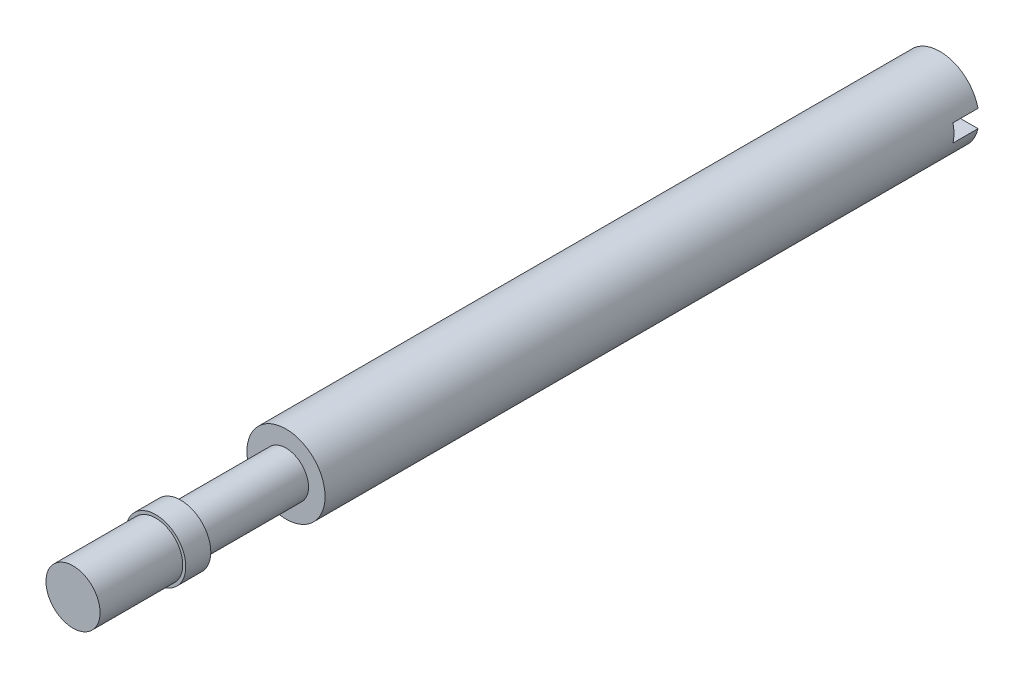
ISO-10303-21;
HEADER;
FILE_DESCRIPTION(('STEP AP214'),'2;1');
FILE_NAME('part.step','',(''),(''),'','','');
FILE_SCHEMA(('AUTOMOTIVE_DESIGN { 1 0 10303 214 1 1 1 1 }'));
ENDSEC;
DATA;
#1=APPLICATION_CONTEXT('core data for automotive mechanical design processes');
#2=APPLICATION_PROTOCOL_DEFINITION('international standard','automotive_design',2000,#1);
#3=PRODUCT_CONTEXT('',#1,'mechanical');
#4=PRODUCT('Part','Part','',(#3));
#5=PRODUCT_RELATED_PRODUCT_CATEGORY('part','',(#4));
#6=PRODUCT_DEFINITION_FORMATION('','',#4);
#7=PRODUCT_DEFINITION_CONTEXT('part definition',#1,'design');
#8=PRODUCT_DEFINITION('design','',#6,#7);
#9=PRODUCT_DEFINITION_SHAPE('','',#8);
#10=(LENGTH_UNIT() NAMED_UNIT(*) SI_UNIT(.MILLI.,.METRE.));
#11=(NAMED_UNIT(*) PLANE_ANGLE_UNIT() SI_UNIT($,.RADIAN.));
#12=(NAMED_UNIT(*) SI_UNIT($,.STERADIAN.) SOLID_ANGLE_UNIT());
#13=UNCERTAINTY_MEASURE_WITH_UNIT(LENGTH_MEASURE(1.E-05),#10,'distance_accuracy_value','');
#14=(GEOMETRIC_REPRESENTATION_CONTEXT(3) GLOBAL_UNCERTAINTY_ASSIGNED_CONTEXT((#13)) GLOBAL_UNIT_ASSIGNED_CONTEXT((#10,
#11,#12)) REPRESENTATION_CONTEXT('',''));
#15=CARTESIAN_POINT('',(0.,0.,0.));
#16=DIRECTION('',(0.,0.,1.));
#17=DIRECTION('',(1.,0.,0.));
#18=AXIS2_PLACEMENT_3D('',#15,#16,#17);
#19=CARTESIAN_POINT('',(1.37160000000002,0.,0.));
#20=DIRECTION('',(0.,0.,1.));
#21=DIRECTION('',(1.,0.,0.));
#22=AXIS2_PLACEMENT_3D('',#19,#20,#21);
#23=PLANE('',#22);
#24=CARTESIAN_POINT('',(0.,0.,0.));
#25=DIRECTION('',(0.,0.,1.));
#26=DIRECTION('',(1.,0.,0.));
#27=AXIS2_PLACEMENT_3D('',#24,#25,#26);
#28=CIRCLE('',#27,1.37160000000002);
#29=CARTESIAN_POINT('',(1.37160000000002,0.,0.));
#30=VERTEX_POINT('',#29);
#31=EDGE_CURVE('E20',#30,#30,#28,.F.);
#32=ORIENTED_EDGE('',*,*,#31,.F.);
#33=EDGE_LOOP('',(#32));
#34=FACE_BOUND('',#33,.T.);
#35=ADVANCED_FACE('F17',(#34),#23,.T.);
#36=CARTESIAN_POINT('',(0.,0.,0.));
#37=DIRECTION('',(0.,0.,1.));
#38=DIRECTION('',(1.,0.,0.));
#39=AXIS2_PLACEMENT_3D('',#36,#37,#38);
#40=CYLINDRICAL_SURFACE('',#39,1.37160000000002);
#41=CARTESIAN_POINT('',(0.,0.,-4.19099999999999));
#42=DIRECTION('',(0.,0.,1.));
#43=DIRECTION('',(1.,0.,0.));
#44=AXIS2_PLACEMENT_3D('',#41,#42,#43);
#45=CIRCLE('',#44,1.37160000000002);
#46=CARTESIAN_POINT('',(1.37160000000003,0.,-4.19099999999998));
#47=VERTEX_POINT('',#46);
#48=EDGE_CURVE('E89',#47,#47,#45,.F.);
#49=ORIENTED_EDGE('',*,*,#48,.F.);
#50=EDGE_LOOP('',(#49));
#51=FACE_BOUND('',#50,.T.);
#52=ORIENTED_EDGE('',*,*,#31,.T.);
#53=EDGE_LOOP('',(#52));
#54=FACE_BOUND('',#53,.T.);
#55=ADVANCED_FACE('F96',(#51,#54),#40,.T.);
#56=CARTESIAN_POINT('',(1.52400000000004,0.,-4.19099999999999));
#57=DIRECTION('',(0.,0.,1.));
#58=DIRECTION('',(1.,0.,0.));
#59=AXIS2_PLACEMENT_3D('',#56,#57,#58);
#60=PLANE('',#59);
#61=ORIENTED_EDGE('',*,*,#48,.T.);
#62=EDGE_LOOP('',(#61));
#63=FACE_BOUND('',#62,.T.);
#64=CARTESIAN_POINT('',(0.,0.,-4.19099999999999));
#65=DIRECTION('',(0.,0.,1.));
#66=DIRECTION('',(1.,0.,0.));
#67=AXIS2_PLACEMENT_3D('',#64,#65,#66);
#68=CIRCLE('',#67,1.52400000000002);
#69=CARTESIAN_POINT('',(1.52400000000003,0.,-4.19099999999999));
#70=VERTEX_POINT('',#69);
#71=EDGE_CURVE('E87',#70,#70,#68,.F.);
#72=ORIENTED_EDGE('',*,*,#71,.F.);
#73=EDGE_LOOP('',(#72));
#74=FACE_BOUND('',#73,.T.);
#75=ADVANCED_FACE('F103',(#63,#74),#60,.T.);
#76=CARTESIAN_POINT('',(0.,0.,0.));
#77=DIRECTION('',(0.,0.,1.));
#78=DIRECTION('',(1.,0.,0.));
#79=AXIS2_PLACEMENT_3D('',#76,#77,#78);
#80=CYLINDRICAL_SURFACE('',#79,1.52400000000002);
#81=CARTESIAN_POINT('',(0.,0.,-5.46099999999999));
#82=DIRECTION('',(0.,0.,1.));
#83=DIRECTION('',(1.,0.,0.));
#84=AXIS2_PLACEMENT_3D('',#81,#82,#83);
#85=CIRCLE('',#84,1.52400000000002);
#86=CARTESIAN_POINT('',(1.52400000000003,0.,-5.46099999999999));
#87=VERTEX_POINT('',#86);
#88=EDGE_CURVE('E67',#87,#87,#85,.F.);
#89=ORIENTED_EDGE('',*,*,#88,.F.);
#90=EDGE_LOOP('',(#89));
#91=FACE_BOUND('',#90,.T.);
#92=ORIENTED_EDGE('',*,*,#71,.T.);
#93=EDGE_LOOP('',(#92));
#94=FACE_BOUND('',#93,.T.);
#95=ADVANCED_FACE('F138',(#91,#94),#80,.T.);
#96=CARTESIAN_POINT('',(1.14300000000002,0.,-5.46099999999999));
#97=DIRECTION('',(0.,0.,-1.));
#98=DIRECTION('',(-1.,0.,0.));
#99=AXIS2_PLACEMENT_3D('',#96,#97,#98);
#100=PLANE('',#99);
#101=ORIENTED_EDGE('',*,*,#88,.T.);
#102=EDGE_LOOP('',(#101));
#103=FACE_BOUND('',#102,.T.);
#104=CARTESIAN_POINT('',(0.,0.,-5.461));
#105=DIRECTION('',(0.,0.,1.));
#106=DIRECTION('',(1.,0.,0.));
#107=AXIS2_PLACEMENT_3D('',#104,#105,#106);
#108=CIRCLE('',#107,1.14300000000001);
#109=CARTESIAN_POINT('',(1.14300000000003,0.,-5.461));
#110=VERTEX_POINT('',#109);
#111=EDGE_CURVE('E204',#110,#110,#108,.F.);
#112=ORIENTED_EDGE('',*,*,#111,.F.);
#113=EDGE_LOOP('',(#112));
#114=FACE_BOUND('',#113,.T.);
#115=ADVANCED_FACE('F135',(#103,#114),#100,.T.);
#116=CARTESIAN_POINT('',(1.93069241206372,-0.444500000000306,-42.6719999999999));
#117=DIRECTION('',(0.,-1.,0.));
#118=DIRECTION('',(1.,0.,0.));
#119=AXIS2_PLACEMENT_3D('',#116,#117,#118);
#120=PLANE('',#119);
#121=DIRECTION('',(0.,0.,1.));
#122=VECTOR('',#121,1.);
#123=CARTESIAN_POINT('',(-1.93069241206355,-0.444500000000308,-42.6719999999999));
#124=LINE('',#123,#122);
#125=CARTESIAN_POINT('',(-1.93069241206351,-0.444500000000307,-42.6719999999999));
#126=VERTEX_POINT('',#125);
#127=CARTESIAN_POINT('',(-1.93069241206351,-0.444500000000293,-43.9419999999999));
#128=VERTEX_POINT('',#127);
#129=EDGE_CURVE('E66',#126,#128,#124,.F.);
#130=ORIENTED_EDGE('',*,*,#129,.F.);
#131=DIRECTION('',(-1.,0.,0.));
#132=VECTOR('',#131,1.);
#133=CARTESIAN_POINT('',(0.,-0.444500000000306,-42.6719999999999));
#134=LINE('',#133,#132);
#135=CARTESIAN_POINT('',(1.93069241206369,-0.444500000000306,-42.6719999999999));
#136=VERTEX_POINT('',#135);
#137=EDGE_CURVE('E71',#136,#126,#134,.T.);
#138=ORIENTED_EDGE('',*,*,#137,.F.);
#139=DIRECTION('',(0.,0.,1.));
#140=VECTOR('',#139,1.);
#141=CARTESIAN_POINT('',(1.93069241206373,-0.444500000000306,-42.6719999999999));
#142=LINE('',#141,#140);
#143=CARTESIAN_POINT('',(1.9306924120637,-0.444500000000292,-43.9419999999999));
#144=VERTEX_POINT('',#143);
#145=EDGE_CURVE('E55',#144,#136,#142,.T.);
#146=ORIENTED_EDGE('',*,*,#145,.F.);
#147=DIRECTION('',(-1.,0.,0.));
#148=VECTOR('',#147,1.);
#149=CARTESIAN_POINT('',(0.,-0.444500000000278,-43.9419999999999));
#150=LINE('',#149,#148);
#151=EDGE_CURVE('E206',#128,#144,#150,.F.);
#152=ORIENTED_EDGE('',*,*,#151,.F.);
#153=EDGE_LOOP('',(#130,#138,#146,#152));
#154=FACE_BOUND('',#153,.T.);
#155=ADVANCED_FACE('F72',(#154),#120,.F.);
#156=CARTESIAN_POINT('',(0.,-2.77555756156289E-13,-42.6719999999999));
#157=DIRECTION('',(0.,0.,-1.));
#158=DIRECTION('',(-1.,0.,0.));
#159=AXIS2_PLACEMENT_3D('',#156,#157,#158);
#160=PLANE('',#159);
#161=CARTESIAN_POINT('',(0.,0.,-42.6719999999999));
#162=DIRECTION('',(0.,0.,1.));
#163=DIRECTION('',(1.,0.,0.));
#164=AXIS2_PLACEMENT_3D('',#161,#162,#163);
#165=CIRCLE('',#164,1.98120000000003);
#166=CARTESIAN_POINT('',(-1.93069241206357,0.444499999999693,-42.6719999999999));
#167=VERTEX_POINT('',#166);
#168=EDGE_CURVE('E75',#126,#167,#165,.F.);
#169=ORIENTED_EDGE('',*,*,#168,.T.);
#170=DIRECTION('',(-1.,0.,0.));
#171=VECTOR('',#170,1.);
#172=CARTESIAN_POINT('',(1.93069241206372,0.444499999999695,-42.6719999999999));
#173=LINE('',#172,#171);
#174=CARTESIAN_POINT('',(1.93069241206376,0.444499999999695,-42.6719999999999));
#175=VERTEX_POINT('',#174);
#176=EDGE_CURVE('E78',#167,#175,#173,.F.);
#177=ORIENTED_EDGE('',*,*,#176,.T.);
#178=CARTESIAN_POINT('',(0.,0.,-42.6719999999999));
#179=DIRECTION('',(0.,0.,1.));
#180=DIRECTION('',(1.,0.,0.));
#181=AXIS2_PLACEMENT_3D('',#178,#179,#180);
#182=CIRCLE('',#181,1.98120000000003);
#183=EDGE_CURVE('E59',#175,#136,#182,.F.);
#184=ORIENTED_EDGE('',*,*,#183,.T.);
#185=ORIENTED_EDGE('',*,*,#137,.T.);
#186=EDGE_LOOP('',(#169,#177,#184,#185));
#187=FACE_BOUND('',#186,.T.);
#188=ADVANCED_FACE('F77',(#187),#160,.T.);
#189=CARTESIAN_POINT('',(0.,0.,0.));
#190=DIRECTION('',(0.,0.,1.));
#191=DIRECTION('',(1.,0.,0.));
#192=AXIS2_PLACEMENT_3D('',#189,#190,#191);
#193=CYLINDRICAL_SURFACE('',#192,1.14300000000001);
#194=CARTESIAN_POINT('',(0.,0.,-10.795));
#195=DIRECTION('',(0.,0.,1.));
#196=DIRECTION('',(1.,0.,0.));
#197=AXIS2_PLACEMENT_3D('',#194,#195,#196);
#198=CIRCLE('',#197,1.14300000000001);
#199=CARTESIAN_POINT('',(1.14300000000004,0.,-10.795));
#200=VERTEX_POINT('',#199);
#201=EDGE_CURVE('E209',#200,#200,#198,.F.);
#202=ORIENTED_EDGE('',*,*,#201,.F.);
#203=EDGE_LOOP('',(#202));
#204=FACE_BOUND('',#203,.T.);
#205=ORIENTED_EDGE('',*,*,#111,.T.);
#206=EDGE_LOOP('',(#205));
#207=FACE_BOUND('',#206,.T.);
#208=ADVANCED_FACE('F126',(#204,#207),#193,.T.);
#209=CARTESIAN_POINT('',(0.,-2.77555756156289E-13,-43.9419999999999));
#210=DIRECTION('',(0.,0.,-1.));
#211=DIRECTION('',(-1.,0.,0.));
#212=AXIS2_PLACEMENT_3D('',#209,#210,#211);
#213=PLANE('',#212);
#214=ORIENTED_EDGE('',*,*,#151,.T.);
#215=CARTESIAN_POINT('',(0.,0.,-43.9419999999999));
#216=DIRECTION('',(0.,0.,1.));
#217=DIRECTION('',(1.,0.,0.));
#218=AXIS2_PLACEMENT_3D('',#215,#216,#217);
#219=CIRCLE('',#218,1.98120000000003);
#220=EDGE_CURVE('E62',#128,#144,#219,.T.);
#221=ORIENTED_EDGE('',*,*,#220,.F.);
#222=EDGE_LOOP('',(#214,#221));
#223=FACE_BOUND('',#222,.T.);
#224=ADVANCED_FACE('F123',(#223),#213,.T.);
#225=CARTESIAN_POINT('',(1.93069241206372,0.444499999999695,-42.6719999999999));
#226=DIRECTION('',(0.,1.,0.));
#227=DIRECTION('',(-1.,0.,0.));
#228=AXIS2_PLACEMENT_3D('',#225,#226,#227);
#229=PLANE('',#228);
#230=DIRECTION('',(0.,0.,1.));
#231=VECTOR('',#230,1.);
#232=CARTESIAN_POINT('',(1.93069241206372,0.444499999999695,-42.6719999999999));
#233=LINE('',#232,#231);
#234=CARTESIAN_POINT('',(1.93069241206376,0.444499999999695,-43.9419999999999));
#235=VERTEX_POINT('',#234);
#236=EDGE_CURVE('E212',#175,#235,#233,.F.);
#237=ORIENTED_EDGE('',*,*,#236,.F.);
#238=ORIENTED_EDGE('',*,*,#176,.F.);
#239=DIRECTION('',(0.,0.,1.));
#240=VECTOR('',#239,1.);
#241=CARTESIAN_POINT('',(-1.93069241206352,0.444499999999693,-42.6719999999999));
#242=LINE('',#241,#240);
#243=CARTESIAN_POINT('',(-1.93069241206357,0.444499999999694,-43.9419999999999));
#244=VERTEX_POINT('',#243);
#245=EDGE_CURVE('E35',#244,#167,#242,.T.);
#246=ORIENTED_EDGE('',*,*,#245,.F.);
#247=DIRECTION('',(-1.,0.,0.));
#248=VECTOR('',#247,1.);
#249=CARTESIAN_POINT('',(0.,0.444499999999695,-43.9419999999999));
#250=LINE('',#249,#248);
#251=EDGE_CURVE('E214',#235,#244,#250,.T.);
#252=ORIENTED_EDGE('',*,*,#251,.F.);
#253=EDGE_LOOP('',(#237,#238,#246,#252));
#254=FACE_BOUND('',#253,.T.);
#255=ADVANCED_FACE('F119',(#254),#229,.F.);
#256=CARTESIAN_POINT('',(1.98120000000003,4.30211422042248E-13,-10.795));
#257=DIRECTION('',(0.,0.,1.));
#258=DIRECTION('',(1.,0.,0.));
#259=AXIS2_PLACEMENT_3D('',#256,#257,#258);
#260=PLANE('',#259);
#261=ORIENTED_EDGE('',*,*,#201,.T.);
#262=EDGE_LOOP('',(#261));
#263=FACE_BOUND('',#262,.T.);
#264=CARTESIAN_POINT('',(0.,0.,-10.795));
#265=DIRECTION('',(0.,0.,1.));
#266=DIRECTION('',(1.,0.,0.));
#267=AXIS2_PLACEMENT_3D('',#264,#265,#266);
#268=CIRCLE('',#267,1.98120000000003);
#269=CARTESIAN_POINT('',(1.98120000000005,0.,-10.795));
#270=VERTEX_POINT('',#269);
#271=EDGE_CURVE('E26',#270,#270,#268,.F.);
#272=ORIENTED_EDGE('',*,*,#271,.F.);
#273=EDGE_LOOP('',(#272));
#274=FACE_BOUND('',#273,.T.);
#275=ADVANCED_FACE('F112',(#263,#274),#260,.T.);
#276=CARTESIAN_POINT('',(0.,-2.77555756156289E-13,-43.9419999999999));
#277=DIRECTION('',(0.,0.,-1.));
#278=DIRECTION('',(-1.,0.,0.));
#279=AXIS2_PLACEMENT_3D('',#276,#277,#278);
#280=PLANE('',#279);
#281=ORIENTED_EDGE('',*,*,#251,.T.);
#282=CARTESIAN_POINT('',(0.,0.,-43.9419999999999));
#283=DIRECTION('',(0.,0.,1.));
#284=DIRECTION('',(1.,0.,0.));
#285=AXIS2_PLACEMENT_3D('',#282,#283,#284);
#286=CIRCLE('',#285,1.98120000000003);
#287=EDGE_CURVE('E11',#235,#244,#286,.T.);
#288=ORIENTED_EDGE('',*,*,#287,.F.);
#289=EDGE_LOOP('',(#281,#288));
#290=FACE_BOUND('',#289,.T.);
#291=ADVANCED_FACE('F106',(#290),#280,.T.);
#292=CARTESIAN_POINT('',(0.,0.,0.));
#293=DIRECTION('',(0.,0.,1.));
#294=DIRECTION('',(1.,0.,0.));
#295=AXIS2_PLACEMENT_3D('',#292,#293,#294);
#296=CYLINDRICAL_SURFACE('',#295,1.98120000000003);
#297=ORIENTED_EDGE('',*,*,#271,.T.);
#298=EDGE_LOOP('',(#297));
#299=FACE_BOUND('',#298,.T.);
#300=ORIENTED_EDGE('',*,*,#287,.T.);
#301=ORIENTED_EDGE('',*,*,#245,.T.);
#302=ORIENTED_EDGE('',*,*,#168,.F.);
#303=ORIENTED_EDGE('',*,*,#129,.T.);
#304=ORIENTED_EDGE('',*,*,#220,.T.);
#305=ORIENTED_EDGE('',*,*,#145,.T.);
#306=ORIENTED_EDGE('',*,*,#183,.F.);
#307=ORIENTED_EDGE('',*,*,#236,.T.);
#308=EDGE_LOOP('',(#300,#301,#302,#303,#304,#305,#306,#307));
#309=FACE_BOUND('',#308,.T.);
#310=ADVANCED_FACE('F57',(#299,#309),#296,.T.);
#311=CLOSED_SHELL('',(#35,#55,#75,#95,#115,#155,#188,#208,#224,#255,#275,#291,#310));
#312=MANIFOLD_SOLID_BREP('B1',#311);
#313=ADVANCED_BREP_SHAPE_REPRESENTATION('',(#18,#312),#14);
#314=SHAPE_DEFINITION_REPRESENTATION(#9,#313);
ENDSEC;
END-ISO-10303-21;
